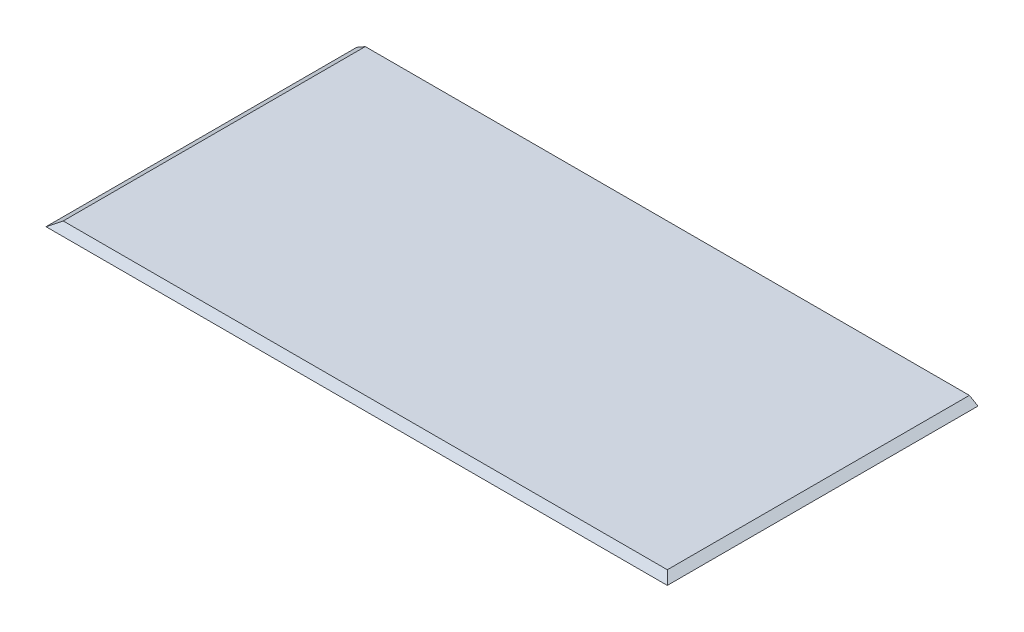
ISO-10303-21;
HEADER;
FILE_DESCRIPTION(('STEP AP214'),'2;1');
FILE_NAME('part.step','',(''),(''),'','','');
FILE_SCHEMA(('AUTOMOTIVE_DESIGN { 1 0 10303 214 1 1 1 1 }'));
ENDSEC;
DATA;
#1=APPLICATION_CONTEXT('core data for automotive mechanical design processes');
#2=APPLICATION_PROTOCOL_DEFINITION('international standard','automotive_design',2000,#1);
#3=PRODUCT_CONTEXT('',#1,'mechanical');
#4=PRODUCT('Part','Part','',(#3));
#5=PRODUCT_RELATED_PRODUCT_CATEGORY('part','',(#4));
#6=PRODUCT_DEFINITION_FORMATION('','',#4);
#7=PRODUCT_DEFINITION_CONTEXT('part definition',#1,'design');
#8=PRODUCT_DEFINITION('design','',#6,#7);
#9=PRODUCT_DEFINITION_SHAPE('','',#8);
#10=(LENGTH_UNIT() NAMED_UNIT(*) SI_UNIT(.MILLI.,.METRE.));
#11=(NAMED_UNIT(*) PLANE_ANGLE_UNIT() SI_UNIT($,.RADIAN.));
#12=(NAMED_UNIT(*) SI_UNIT($,.STERADIAN.) SOLID_ANGLE_UNIT());
#13=UNCERTAINTY_MEASURE_WITH_UNIT(LENGTH_MEASURE(1.E-05),#10,'distance_accuracy_value','');
#14=(GEOMETRIC_REPRESENTATION_CONTEXT(3) GLOBAL_UNCERTAINTY_ASSIGNED_CONTEXT((#13)) GLOBAL_UNIT_ASSIGNED_CONTEXT((#10,
#11,#12)) REPRESENTATION_CONTEXT('',''));
#15=CARTESIAN_POINT('',(0.,0.,0.));
#16=DIRECTION('',(0.,0.,1.));
#17=DIRECTION('',(1.,0.,0.));
#18=AXIS2_PLACEMENT_3D('',#15,#16,#17);
#19=CARTESIAN_POINT('',(0.,0.,0.));
#20=DIRECTION('',(0.,-1.,0.));
#21=DIRECTION('',(0.,0.,-1.));
#22=AXIS2_PLACEMENT_3D('',#19,#20,#21);
#23=PLANE('',#22);
#24=DIRECTION('',(-1.,0.,0.));
#25=VECTOR('',#24,1.);
#26=CARTESIAN_POINT('',(-125.,0.,0.));
#27=LINE('',#26,#25);
#28=CARTESIAN_POINT('',(125.,0.,0.));
#29=VERTEX_POINT('',#28);
#30=CARTESIAN_POINT('',(-125.,0.,0.));
#31=VERTEX_POINT('',#30);
#32=EDGE_CURVE('E176',#29,#31,#27,.T.);
#33=ORIENTED_EDGE('',*,*,#32,.T.);
#34=DIRECTION('',(0.,0.,1.));
#35=VECTOR('',#34,1.);
#36=CARTESIAN_POINT('',(-125.,0.,125.));
#37=LINE('',#36,#35);
#38=CARTESIAN_POINT('',(-125.,0.,-125.));
#39=VERTEX_POINT('',#38);
#40=EDGE_CURVE('E184',#39,#31,#37,.T.);
#41=ORIENTED_EDGE('',*,*,#40,.F.);
#42=DIRECTION('',(-1.,0.,0.));
#43=VECTOR('',#42,1.);
#44=CARTESIAN_POINT('',(-125.,0.,-125.));
#45=LINE('',#44,#43);
#46=CARTESIAN_POINT('',(125.,0.,-125.));
#47=VERTEX_POINT('',#46);
#48=EDGE_CURVE('E190',#47,#39,#45,.T.);
#49=ORIENTED_EDGE('',*,*,#48,.F.);
#50=DIRECTION('',(0.,0.,-1.));
#51=VECTOR('',#50,1.);
#52=CARTESIAN_POINT('',(125.,0.,125.));
#53=LINE('',#52,#51);
#54=EDGE_CURVE('E193',#29,#47,#53,.T.);
#55=ORIENTED_EDGE('',*,*,#54,.F.);
#56=EDGE_LOOP('',(#33,#41,#49,#55));
#57=FACE_BOUND('',#56,.T.);
#58=DIRECTION('',(1.,0.,0.));
#59=VECTOR('',#58,1.);
#60=CARTESIAN_POINT('',(-110.253353701861,0.,-24.7032689142541));
#61=LINE('',#60,#59);
#62=CARTESIAN_POINT('',(-110.253353701861,0.,-24.7032689142541));
#63=VERTEX_POINT('',#62);
#64=CARTESIAN_POINT('',(-100.253353701861,0.,-24.7032689142541));
#65=VERTEX_POINT('',#64);
#66=EDGE_CURVE('E315',#63,#65,#61,.T.);
#67=ORIENTED_EDGE('',*,*,#66,.F.);
#68=DIRECTION('',(0.,0.,-1.));
#69=VECTOR('',#68,1.);
#70=CARTESIAN_POINT('',(-110.253353701861,0.,-14.7032689142541));
#71=LINE('',#70,#69);
#72=CARTESIAN_POINT('',(-110.253353701861,0.,-14.7032689142541));
#73=VERTEX_POINT('',#72);
#74=EDGE_CURVE('E301',#73,#63,#71,.T.);
#75=ORIENTED_EDGE('',*,*,#74,.F.);
#76=DIRECTION('',(-1.,0.,0.));
#77=VECTOR('',#76,1.);
#78=CARTESIAN_POINT('',(-110.253353701861,0.,-14.7032689142541));
#79=LINE('',#78,#77);
#80=CARTESIAN_POINT('',(-100.253353701861,0.,-14.7032689142541));
#81=VERTEX_POINT('',#80);
#82=EDGE_CURVE('E306',#81,#73,#79,.T.);
#83=ORIENTED_EDGE('',*,*,#82,.F.);
#84=DIRECTION('',(0.,0.,1.));
#85=VECTOR('',#84,1.);
#86=CARTESIAN_POINT('',(-100.253353701861,0.,-14.7032689142541));
#87=LINE('',#86,#85);
#88=EDGE_CURVE('E317',#65,#81,#87,.T.);
#89=ORIENTED_EDGE('',*,*,#88,.F.);
#90=EDGE_LOOP('',(#67,#75,#83,#89));
#91=FACE_BOUND('',#90,.T.);
#92=DIRECTION('',(1.,0.,0.));
#93=VECTOR('',#92,1.);
#94=CARTESIAN_POINT('',(-110.253353701861,0.,-109.703268914254));
#95=LINE('',#94,#93);
#96=CARTESIAN_POINT('',(-110.253353701861,0.,-109.703268914254));
#97=VERTEX_POINT('',#96);
#98=CARTESIAN_POINT('',(-100.253353701861,0.,-109.703268914254));
#99=VERTEX_POINT('',#98);
#100=EDGE_CURVE('E286',#97,#99,#95,.T.);
#101=ORIENTED_EDGE('',*,*,#100,.F.);
#102=DIRECTION('',(0.,0.,-1.));
#103=VECTOR('',#102,1.);
#104=CARTESIAN_POINT('',(-110.253353701861,0.,-99.7032689142541));
#105=LINE('',#104,#103);
#106=CARTESIAN_POINT('',(-110.253353701861,0.,-99.7032689142541));
#107=VERTEX_POINT('',#106);
#108=EDGE_CURVE('E272',#107,#97,#105,.T.);
#109=ORIENTED_EDGE('',*,*,#108,.F.);
#110=DIRECTION('',(-1.,0.,0.));
#111=VECTOR('',#110,1.);
#112=CARTESIAN_POINT('',(-110.253353701861,0.,-99.7032689142541));
#113=LINE('',#112,#111);
#114=CARTESIAN_POINT('',(-100.253353701861,0.,-99.7032689142541));
#115=VERTEX_POINT('',#114);
#116=EDGE_CURVE('E277',#115,#107,#113,.T.);
#117=ORIENTED_EDGE('',*,*,#116,.F.);
#118=DIRECTION('',(0.,0.,1.));
#119=VECTOR('',#118,1.);
#120=CARTESIAN_POINT('',(-100.253353701861,0.,-99.7032689142541));
#121=LINE('',#120,#119);
#122=EDGE_CURVE('E288',#99,#115,#121,.T.);
#123=ORIENTED_EDGE('',*,*,#122,.F.);
#124=EDGE_LOOP('',(#101,#109,#117,#123));
#125=FACE_BOUND('',#124,.T.);
#126=DIRECTION('',(1.,0.,0.));
#127=VECTOR('',#126,1.);
#128=CARTESIAN_POINT('',(99.7466462981393,0.,-24.7032689142542));
#129=LINE('',#128,#127);
#130=CARTESIAN_POINT('',(99.7466462981393,0.,-24.7032689142542));
#131=VERTEX_POINT('',#130);
#132=CARTESIAN_POINT('',(109.746646298139,0.,-24.7032689142542));
#133=VERTEX_POINT('',#132);
#134=EDGE_CURVE('E259',#131,#133,#129,.T.);
#135=ORIENTED_EDGE('',*,*,#134,.F.);
#136=DIRECTION('',(0.,0.,-1.));
#137=VECTOR('',#136,1.);
#138=CARTESIAN_POINT('',(99.7466462981393,0.,-14.7032689142542));
#139=LINE('',#138,#137);
#140=CARTESIAN_POINT('',(99.7466462981393,0.,-14.7032689142542));
#141=VERTEX_POINT('',#140);
#142=EDGE_CURVE('E245',#141,#131,#139,.T.);
#143=ORIENTED_EDGE('',*,*,#142,.F.);
#144=DIRECTION('',(-1.,0.,0.));
#145=VECTOR('',#144,1.);
#146=CARTESIAN_POINT('',(99.7466462981393,0.,-14.7032689142542));
#147=LINE('',#146,#145);
#148=CARTESIAN_POINT('',(109.746646298139,0.,-14.7032689142542));
#149=VERTEX_POINT('',#148);
#150=EDGE_CURVE('E250',#149,#141,#147,.T.);
#151=ORIENTED_EDGE('',*,*,#150,.F.);
#152=DIRECTION('',(0.,0.,1.));
#153=VECTOR('',#152,1.);
#154=CARTESIAN_POINT('',(109.746646298139,0.,-14.7032689142542));
#155=LINE('',#154,#153);
#156=EDGE_CURVE('E261',#133,#149,#155,.T.);
#157=ORIENTED_EDGE('',*,*,#156,.F.);
#158=EDGE_LOOP('',(#135,#143,#151,#157));
#159=FACE_BOUND('',#158,.T.);
#160=DIRECTION('',(1.,0.,0.));
#161=VECTOR('',#160,1.);
#162=CARTESIAN_POINT('',(99.7466462981393,0.,-109.703268914254));
#163=LINE('',#162,#161);
#164=CARTESIAN_POINT('',(99.7466462981393,0.,-109.703268914254));
#165=VERTEX_POINT('',#164);
#166=CARTESIAN_POINT('',(109.746646298139,0.,-109.703268914254));
#167=VERTEX_POINT('',#166);
#168=EDGE_CURVE('E232',#165,#167,#163,.T.);
#169=ORIENTED_EDGE('',*,*,#168,.F.);
#170=DIRECTION('',(0.,0.,-1.));
#171=VECTOR('',#170,1.);
#172=CARTESIAN_POINT('',(99.7466462981393,0.,-99.7032689142542));
#173=LINE('',#172,#171);
#174=CARTESIAN_POINT('',(99.7466462981393,0.,-99.7032689142542));
#175=VERTEX_POINT('',#174);
#176=EDGE_CURVE('E213',#175,#165,#173,.T.);
#177=ORIENTED_EDGE('',*,*,#176,.F.);
#178=DIRECTION('',(-1.,0.,0.));
#179=VECTOR('',#178,1.);
#180=CARTESIAN_POINT('',(99.7466462981393,0.,-99.7032689142542));
#181=LINE('',#180,#179);
#182=CARTESIAN_POINT('',(109.746646298139,0.,-99.7032689142542));
#183=VERTEX_POINT('',#182);
#184=EDGE_CURVE('E223',#183,#175,#181,.T.);
#185=ORIENTED_EDGE('',*,*,#184,.F.);
#186=DIRECTION('',(0.,0.,1.));
#187=VECTOR('',#186,1.);
#188=CARTESIAN_POINT('',(109.746646298139,0.,-99.7032689142542));
#189=LINE('',#188,#187);
#190=EDGE_CURVE('E234',#167,#183,#189,.T.);
#191=ORIENTED_EDGE('',*,*,#190,.F.);
#192=EDGE_LOOP('',(#169,#177,#185,#191));
#193=FACE_BOUND('',#192,.T.);
#194=ADVANCED_FACE('F34',(#57,#91,#125,#159,#193),#23,.T.);
#195=CARTESIAN_POINT('',(-125.,2.,-125.));
#196=DIRECTION('',(0.,0.,1.));
#197=DIRECTION('',(1.,0.,0.));
#198=AXIS2_PLACEMENT_3D('',#195,#196,#197);
#199=PLANE('',#198);
#200=DIRECTION('',(-1.,0.,0.));
#201=VECTOR('',#200,1.);
#202=CARTESIAN_POINT('',(-125.,2.,-125.));
#203=LINE('',#202,#201);
#204=CARTESIAN_POINT('',(121.535898384862,2.,-125.));
#205=VERTEX_POINT('',#204);
#206=CARTESIAN_POINT('',(-121.535898384862,2.,-125.));
#207=VERTEX_POINT('',#206);
#208=EDGE_CURVE('E42',#205,#207,#203,.T.);
#209=ORIENTED_EDGE('',*,*,#208,.F.);
#210=DIRECTION('',(-0.866025403784441,0.499999999999995,0.));
#211=VECTOR('',#210,1.);
#212=CARTESIAN_POINT('',(121.535898384862,2.,-125.));
#213=LINE('',#212,#211);
#214=EDGE_CURVE('E207',#47,#205,#213,.T.);
#215=ORIENTED_EDGE('',*,*,#214,.F.);
#216=ORIENTED_EDGE('',*,*,#48,.T.);
#217=DIRECTION('',(-0.866025403784441,-0.499999999999995,0.));
#218=VECTOR('',#217,1.);
#219=CARTESIAN_POINT('',(-121.535898384862,2.,-125.));
#220=LINE('',#219,#218);
#221=EDGE_CURVE('E181',#207,#39,#220,.T.);
#222=ORIENTED_EDGE('',*,*,#221,.F.);
#223=EDGE_LOOP('',(#209,#215,#216,#222));
#224=FACE_BOUND('',#223,.T.);
#225=ADVANCED_FACE('F36',(#224),#199,.F.);
#226=CARTESIAN_POINT('',(0.,2.,0.));
#227=DIRECTION('',(0.,-1.,0.));
#228=DIRECTION('',(0.,0.,-1.));
#229=AXIS2_PLACEMENT_3D('',#226,#227,#228);
#230=PLANE('',#229);
#231=DIRECTION('',(0.,0.,-1.));
#232=VECTOR('',#231,1.);
#233=CARTESIAN_POINT('',(-121.535898384862,2.,4.00000000000006));
#234=LINE('',#233,#232);
#235=CARTESIAN_POINT('',(-121.535898384862,2.,-3.4641016151378));
#236=VERTEX_POINT('',#235);
#237=EDGE_CURVE('E211',#236,#207,#234,.T.);
#238=ORIENTED_EDGE('',*,*,#237,.F.);
#239=DIRECTION('',(1.,0.,0.));
#240=VECTOR('',#239,1.);
#241=CARTESIAN_POINT('',(-125.,2.,-3.4641016151378));
#242=LINE('',#241,#240);
#243=CARTESIAN_POINT('',(121.535898384862,2.,-3.46410161513779));
#244=VERTEX_POINT('',#243);
#245=EDGE_CURVE('E178',#236,#244,#242,.T.);
#246=ORIENTED_EDGE('',*,*,#245,.T.);
#247=DIRECTION('',(0.,0.,-1.));
#248=VECTOR('',#247,1.);
#249=CARTESIAN_POINT('',(121.535898384862,2.,4.00000000000006));
#250=LINE('',#249,#248);
#251=EDGE_CURVE('E210',#244,#205,#250,.T.);
#252=ORIENTED_EDGE('',*,*,#251,.T.);
#253=ORIENTED_EDGE('',*,*,#208,.T.);
#254=EDGE_LOOP('',(#238,#246,#252,#253));
#255=FACE_BOUND('',#254,.T.);
#256=ADVANCED_FACE('F354',(#255),#230,.F.);
#257=CARTESIAN_POINT('',(-110.253353701861,-10.,-14.7032689142541));
#258=DIRECTION('',(1.,0.,0.));
#259=DIRECTION('',(0.,0.,-1.));
#260=AXIS2_PLACEMENT_3D('',#257,#258,#259);
#261=PLANE('',#260);
#262=ORIENTED_EDGE('',*,*,#74,.T.);
#263=DIRECTION('',(0.,1.,0.));
#264=VECTOR('',#263,1.);
#265=CARTESIAN_POINT('',(-110.253353701861,-10.,-24.7032689142541));
#266=LINE('',#265,#264);
#267=CARTESIAN_POINT('',(-110.253353701861,-10.,-24.7032689142541));
#268=VERTEX_POINT('',#267);
#269=EDGE_CURVE('E194',#268,#63,#266,.T.);
#270=ORIENTED_EDGE('',*,*,#269,.F.);
#271=DIRECTION('',(0.,0.,-1.));
#272=VECTOR('',#271,1.);
#273=CARTESIAN_POINT('',(-110.253353701861,-10.,-14.7032689142541));
#274=LINE('',#273,#272);
#275=CARTESIAN_POINT('',(-110.253353701861,-10.,-14.7032689142541));
#276=VERTEX_POINT('',#275);
#277=EDGE_CURVE('E302',#276,#268,#274,.T.);
#278=ORIENTED_EDGE('',*,*,#277,.F.);
#279=DIRECTION('',(0.,1.,0.));
#280=VECTOR('',#279,1.);
#281=CARTESIAN_POINT('',(-110.253353701861,-10.,-14.7032689142541));
#282=LINE('',#281,#280);
#283=EDGE_CURVE('E312',#276,#73,#282,.T.);
#284=ORIENTED_EDGE('',*,*,#283,.T.);
#285=EDGE_LOOP('',(#262,#270,#278,#284));
#286=FACE_BOUND('',#285,.T.);
#287=ADVANCED_FACE('F342',(#286),#261,.F.);
#288=CARTESIAN_POINT('',(-110.253353701861,-10.,-24.7032689142541));
#289=DIRECTION('',(0.,0.,1.));
#290=DIRECTION('',(1.,0.,0.));
#291=AXIS2_PLACEMENT_3D('',#288,#289,#290);
#292=PLANE('',#291);
#293=ORIENTED_EDGE('',*,*,#66,.T.);
#294=DIRECTION('',(0.,1.,0.));
#295=VECTOR('',#294,1.);
#296=CARTESIAN_POINT('',(-100.253353701861,-10.,-24.7032689142541));
#297=LINE('',#296,#295);
#298=CARTESIAN_POINT('',(-100.253353701861,-10.,-24.7032689142541));
#299=VERTEX_POINT('',#298);
#300=EDGE_CURVE('E197',#299,#65,#297,.T.);
#301=ORIENTED_EDGE('',*,*,#300,.F.);
#302=DIRECTION('',(1.,0.,0.));
#303=VECTOR('',#302,1.);
#304=CARTESIAN_POINT('',(-110.253353701861,-10.,-24.7032689142541));
#305=LINE('',#304,#303);
#306=EDGE_CURVE('E305',#268,#299,#305,.T.);
#307=ORIENTED_EDGE('',*,*,#306,.F.);
#308=ORIENTED_EDGE('',*,*,#269,.T.);
#309=EDGE_LOOP('',(#293,#301,#307,#308));
#310=FACE_BOUND('',#309,.T.);
#311=ADVANCED_FACE('F346',(#310),#292,.F.);
#312=CARTESIAN_POINT('',(-100.253353701861,-10.,-14.7032689142541));
#313=DIRECTION('',(-1.,0.,0.));
#314=DIRECTION('',(0.,0.,1.));
#315=AXIS2_PLACEMENT_3D('',#312,#313,#314);
#316=PLANE('',#315);
#317=ORIENTED_EDGE('',*,*,#88,.T.);
#318=DIRECTION('',(0.,1.,0.));
#319=VECTOR('',#318,1.);
#320=CARTESIAN_POINT('',(-100.253353701861,-10.,-14.7032689142541));
#321=LINE('',#320,#319);
#322=CARTESIAN_POINT('',(-100.253353701861,-10.,-14.7032689142541));
#323=VERTEX_POINT('',#322);
#324=EDGE_CURVE('E323',#323,#81,#321,.T.);
#325=ORIENTED_EDGE('',*,*,#324,.F.);
#326=DIRECTION('',(0.,0.,1.));
#327=VECTOR('',#326,1.);
#328=CARTESIAN_POINT('',(-100.253353701861,-10.,-14.7032689142541));
#329=LINE('',#328,#327);
#330=EDGE_CURVE('E308',#299,#323,#329,.T.);
#331=ORIENTED_EDGE('',*,*,#330,.F.);
#332=ORIENTED_EDGE('',*,*,#300,.T.);
#333=EDGE_LOOP('',(#317,#325,#331,#332));
#334=FACE_BOUND('',#333,.T.);
#335=ADVANCED_FACE('F329',(#334),#316,.F.);
#336=CARTESIAN_POINT('',(-110.253353701861,-10.,-14.7032689142541));
#337=DIRECTION('',(0.,0.,-1.));
#338=DIRECTION('',(-1.,0.,0.));
#339=AXIS2_PLACEMENT_3D('',#336,#337,#338);
#340=PLANE('',#339);
#341=ORIENTED_EDGE('',*,*,#82,.T.);
#342=ORIENTED_EDGE('',*,*,#283,.F.);
#343=DIRECTION('',(-1.,0.,0.));
#344=VECTOR('',#343,1.);
#345=CARTESIAN_POINT('',(-110.253353701861,-10.,-14.7032689142541));
#346=LINE('',#345,#344);
#347=EDGE_CURVE('E310',#323,#276,#346,.T.);
#348=ORIENTED_EDGE('',*,*,#347,.F.);
#349=ORIENTED_EDGE('',*,*,#324,.T.);
#350=EDGE_LOOP('',(#341,#342,#348,#349));
#351=FACE_BOUND('',#350,.T.);
#352=ADVANCED_FACE('F338',(#351),#340,.F.);
#353=CARTESIAN_POINT('',(0.,-10.,0.));
#354=DIRECTION('',(0.,-1.,0.));
#355=DIRECTION('',(0.,0.,-1.));
#356=AXIS2_PLACEMENT_3D('',#353,#354,#355);
#357=PLANE('',#356);
#358=ORIENTED_EDGE('',*,*,#277,.T.);
#359=ORIENTED_EDGE('',*,*,#306,.T.);
#360=ORIENTED_EDGE('',*,*,#330,.T.);
#361=ORIENTED_EDGE('',*,*,#347,.T.);
#362=EDGE_LOOP('',(#358,#359,#360,#361));
#363=FACE_BOUND('',#362,.T.);
#364=ADVANCED_FACE('F345',(#363),#357,.T.);
#365=CARTESIAN_POINT('',(-110.253353701861,-10.,-99.7032689142541));
#366=DIRECTION('',(1.,0.,0.));
#367=DIRECTION('',(0.,0.,-1.));
#368=AXIS2_PLACEMENT_3D('',#365,#366,#367);
#369=PLANE('',#368);
#370=ORIENTED_EDGE('',*,*,#108,.T.);
#371=DIRECTION('',(0.,1.,0.));
#372=VECTOR('',#371,1.);
#373=CARTESIAN_POINT('',(-110.253353701861,-10.,-109.703268914254));
#374=LINE('',#373,#372);
#375=CARTESIAN_POINT('',(-110.253353701861,-10.,-109.703268914254));
#376=VERTEX_POINT('',#375);
#377=EDGE_CURVE('E299',#376,#97,#374,.T.);
#378=ORIENTED_EDGE('',*,*,#377,.F.);
#379=DIRECTION('',(0.,0.,-1.));
#380=VECTOR('',#379,1.);
#381=CARTESIAN_POINT('',(-110.253353701861,-10.,-99.7032689142541));
#382=LINE('',#381,#380);
#383=CARTESIAN_POINT('',(-110.253353701861,-10.,-99.7032689142541));
#384=VERTEX_POINT('',#383);
#385=EDGE_CURVE('E273',#384,#376,#382,.T.);
#386=ORIENTED_EDGE('',*,*,#385,.F.);
#387=DIRECTION('',(0.,1.,0.));
#388=VECTOR('',#387,1.);
#389=CARTESIAN_POINT('',(-110.253353701861,-10.,-99.7032689142541));
#390=LINE('',#389,#388);
#391=EDGE_CURVE('E283',#384,#107,#390,.T.);
#392=ORIENTED_EDGE('',*,*,#391,.T.);
#393=EDGE_LOOP('',(#370,#378,#386,#392));
#394=FACE_BOUND('',#393,.T.);
#395=ADVANCED_FACE('F429',(#394),#369,.F.);
#396=CARTESIAN_POINT('',(-110.253353701861,-10.,-109.703268914254));
#397=DIRECTION('',(0.,0.,1.));
#398=DIRECTION('',(1.,0.,0.));
#399=AXIS2_PLACEMENT_3D('',#396,#397,#398);
#400=PLANE('',#399);
#401=ORIENTED_EDGE('',*,*,#100,.T.);
#402=DIRECTION('',(0.,1.,0.));
#403=VECTOR('',#402,1.);
#404=CARTESIAN_POINT('',(-100.253353701861,-10.,-109.703268914254));
#405=LINE('',#404,#403);
#406=CARTESIAN_POINT('',(-100.253353701861,-10.,-109.703268914254));
#407=VERTEX_POINT('',#406);
#408=EDGE_CURVE('E296',#407,#99,#405,.T.);
#409=ORIENTED_EDGE('',*,*,#408,.F.);
#410=DIRECTION('',(1.,0.,0.));
#411=VECTOR('',#410,1.);
#412=CARTESIAN_POINT('',(-110.253353701861,-10.,-109.703268914254));
#413=LINE('',#412,#411);
#414=EDGE_CURVE('E276',#376,#407,#413,.T.);
#415=ORIENTED_EDGE('',*,*,#414,.F.);
#416=ORIENTED_EDGE('',*,*,#377,.T.);
#417=EDGE_LOOP('',(#401,#409,#415,#416));
#418=FACE_BOUND('',#417,.T.);
#419=ADVANCED_FACE('F425',(#418),#400,.F.);
#420=CARTESIAN_POINT('',(-100.253353701861,-10.,-99.7032689142541));
#421=DIRECTION('',(-1.,0.,0.));
#422=DIRECTION('',(0.,0.,1.));
#423=AXIS2_PLACEMENT_3D('',#420,#421,#422);
#424=PLANE('',#423);
#425=ORIENTED_EDGE('',*,*,#122,.T.);
#426=DIRECTION('',(0.,1.,0.));
#427=VECTOR('',#426,1.);
#428=CARTESIAN_POINT('',(-100.253353701861,-10.,-99.7032689142541));
#429=LINE('',#428,#427);
#430=CARTESIAN_POINT('',(-100.253353701861,-10.,-99.7032689142541));
#431=VERTEX_POINT('',#430);
#432=EDGE_CURVE('E294',#431,#115,#429,.T.);
#433=ORIENTED_EDGE('',*,*,#432,.F.);
#434=DIRECTION('',(0.,0.,1.));
#435=VECTOR('',#434,1.);
#436=CARTESIAN_POINT('',(-100.253353701861,-10.,-99.7032689142541));
#437=LINE('',#436,#435);
#438=EDGE_CURVE('E279',#407,#431,#437,.T.);
#439=ORIENTED_EDGE('',*,*,#438,.F.);
#440=ORIENTED_EDGE('',*,*,#408,.T.);
#441=EDGE_LOOP('',(#425,#433,#439,#440));
#442=FACE_BOUND('',#441,.T.);
#443=ADVANCED_FACE('F421',(#442),#424,.F.);
#444=CARTESIAN_POINT('',(-110.253353701861,-10.,-99.7032689142541));
#445=DIRECTION('',(0.,0.,-1.));
#446=DIRECTION('',(-1.,0.,0.));
#447=AXIS2_PLACEMENT_3D('',#444,#445,#446);
#448=PLANE('',#447);
#449=ORIENTED_EDGE('',*,*,#116,.T.);
#450=ORIENTED_EDGE('',*,*,#391,.F.);
#451=DIRECTION('',(-1.,0.,0.));
#452=VECTOR('',#451,1.);
#453=CARTESIAN_POINT('',(-110.253353701861,-10.,-99.7032689142541));
#454=LINE('',#453,#452);
#455=EDGE_CURVE('E281',#431,#384,#454,.T.);
#456=ORIENTED_EDGE('',*,*,#455,.F.);
#457=ORIENTED_EDGE('',*,*,#432,.T.);
#458=EDGE_LOOP('',(#449,#450,#456,#457));
#459=FACE_BOUND('',#458,.T.);
#460=ADVANCED_FACE('F417',(#459),#448,.F.);
#461=CARTESIAN_POINT('',(0.,-10.,0.));
#462=DIRECTION('',(0.,-1.,0.));
#463=DIRECTION('',(0.,0.,-1.));
#464=AXIS2_PLACEMENT_3D('',#461,#462,#463);
#465=PLANE('',#464);
#466=ORIENTED_EDGE('',*,*,#385,.T.);
#467=ORIENTED_EDGE('',*,*,#414,.T.);
#468=ORIENTED_EDGE('',*,*,#438,.T.);
#469=ORIENTED_EDGE('',*,*,#455,.T.);
#470=EDGE_LOOP('',(#466,#467,#468,#469));
#471=FACE_BOUND('',#470,.T.);
#472=ADVANCED_FACE('F413',(#471),#465,.T.);
#473=CARTESIAN_POINT('',(99.7466462981393,-10.,-14.7032689142542));
#474=DIRECTION('',(1.,0.,0.));
#475=DIRECTION('',(0.,0.,-1.));
#476=AXIS2_PLACEMENT_3D('',#473,#474,#475);
#477=PLANE('',#476);
#478=ORIENTED_EDGE('',*,*,#142,.T.);
#479=DIRECTION('',(0.,1.,0.));
#480=VECTOR('',#479,1.);
#481=CARTESIAN_POINT('',(99.7466462981393,-10.,-24.7032689142542));
#482=LINE('',#481,#480);
#483=CARTESIAN_POINT('',(99.7466462981393,-10.,-24.7032689142542));
#484=VERTEX_POINT('',#483);
#485=EDGE_CURVE('E270',#484,#131,#482,.T.);
#486=ORIENTED_EDGE('',*,*,#485,.F.);
#487=DIRECTION('',(0.,0.,-1.));
#488=VECTOR('',#487,1.);
#489=CARTESIAN_POINT('',(99.7466462981393,-10.,-14.7032689142542));
#490=LINE('',#489,#488);
#491=CARTESIAN_POINT('',(99.7466462981393,-10.,-14.7032689142542));
#492=VERTEX_POINT('',#491);
#493=EDGE_CURVE('E246',#492,#484,#490,.T.);
#494=ORIENTED_EDGE('',*,*,#493,.F.);
#495=DIRECTION('',(0.,1.,0.));
#496=VECTOR('',#495,1.);
#497=CARTESIAN_POINT('',(99.7466462981393,-10.,-14.7032689142542));
#498=LINE('',#497,#496);
#499=EDGE_CURVE('E256',#492,#141,#498,.T.);
#500=ORIENTED_EDGE('',*,*,#499,.T.);
#501=EDGE_LOOP('',(#478,#486,#494,#500));
#502=FACE_BOUND('',#501,.T.);
#503=ADVANCED_FACE('F409',(#502),#477,.F.);
#504=CARTESIAN_POINT('',(99.7466462981393,-10.,-24.7032689142542));
#505=DIRECTION('',(0.,0.,1.));
#506=DIRECTION('',(1.,0.,0.));
#507=AXIS2_PLACEMENT_3D('',#504,#505,#506);
#508=PLANE('',#507);
#509=ORIENTED_EDGE('',*,*,#134,.T.);
#510=DIRECTION('',(0.,1.,0.));
#511=VECTOR('',#510,1.);
#512=CARTESIAN_POINT('',(109.746646298139,-10.,-24.7032689142542));
#513=LINE('',#512,#511);
#514=CARTESIAN_POINT('',(109.746646298139,-10.,-24.7032689142542));
#515=VERTEX_POINT('',#514);
#516=EDGE_CURVE('E267',#515,#133,#513,.T.);
#517=ORIENTED_EDGE('',*,*,#516,.F.);
#518=DIRECTION('',(1.,0.,0.));
#519=VECTOR('',#518,1.);
#520=CARTESIAN_POINT('',(99.7466462981393,-10.,-24.7032689142542));
#521=LINE('',#520,#519);
#522=EDGE_CURVE('E249',#484,#515,#521,.T.);
#523=ORIENTED_EDGE('',*,*,#522,.F.);
#524=ORIENTED_EDGE('',*,*,#485,.T.);
#525=EDGE_LOOP('',(#509,#517,#523,#524));
#526=FACE_BOUND('',#525,.T.);
#527=ADVANCED_FACE('F405',(#526),#508,.F.);
#528=CARTESIAN_POINT('',(109.746646298139,-10.,-14.7032689142542));
#529=DIRECTION('',(-1.,0.,0.));
#530=DIRECTION('',(0.,0.,1.));
#531=AXIS2_PLACEMENT_3D('',#528,#529,#530);
#532=PLANE('',#531);
#533=ORIENTED_EDGE('',*,*,#156,.T.);
#534=DIRECTION('',(0.,1.,0.));
#535=VECTOR('',#534,1.);
#536=CARTESIAN_POINT('',(109.746646298139,-10.,-14.7032689142542));
#537=LINE('',#536,#535);
#538=CARTESIAN_POINT('',(109.746646298139,-10.,-14.7032689142542));
#539=VERTEX_POINT('',#538);
#540=EDGE_CURVE('E57',#539,#149,#537,.T.);
#541=ORIENTED_EDGE('',*,*,#540,.F.);
#542=DIRECTION('',(0.,0.,1.));
#543=VECTOR('',#542,1.);
#544=CARTESIAN_POINT('',(109.746646298139,-10.,-14.7032689142542));
#545=LINE('',#544,#543);
#546=EDGE_CURVE('E252',#515,#539,#545,.T.);
#547=ORIENTED_EDGE('',*,*,#546,.F.);
#548=ORIENTED_EDGE('',*,*,#516,.T.);
#549=EDGE_LOOP('',(#533,#541,#547,#548));
#550=FACE_BOUND('',#549,.T.);
#551=ADVANCED_FACE('F402',(#550),#532,.F.);
#552=CARTESIAN_POINT('',(99.7466462981393,-10.,-14.7032689142542));
#553=DIRECTION('',(0.,0.,-1.));
#554=DIRECTION('',(-1.,0.,0.));
#555=AXIS2_PLACEMENT_3D('',#552,#553,#554);
#556=PLANE('',#555);
#557=ORIENTED_EDGE('',*,*,#150,.T.);
#558=ORIENTED_EDGE('',*,*,#499,.F.);
#559=DIRECTION('',(-1.,0.,0.));
#560=VECTOR('',#559,1.);
#561=CARTESIAN_POINT('',(99.7466462981393,-10.,-14.7032689142542));
#562=LINE('',#561,#560);
#563=EDGE_CURVE('E254',#539,#492,#562,.T.);
#564=ORIENTED_EDGE('',*,*,#563,.F.);
#565=ORIENTED_EDGE('',*,*,#540,.T.);
#566=EDGE_LOOP('',(#557,#558,#564,#565));
#567=FACE_BOUND('',#566,.T.);
#568=ADVANCED_FACE('F398',(#567),#556,.F.);
#569=CARTESIAN_POINT('',(0.,-10.,0.));
#570=DIRECTION('',(0.,-1.,0.));
#571=DIRECTION('',(0.,0.,-1.));
#572=AXIS2_PLACEMENT_3D('',#569,#570,#571);
#573=PLANE('',#572);
#574=ORIENTED_EDGE('',*,*,#493,.T.);
#575=ORIENTED_EDGE('',*,*,#522,.T.);
#576=ORIENTED_EDGE('',*,*,#546,.T.);
#577=ORIENTED_EDGE('',*,*,#563,.T.);
#578=EDGE_LOOP('',(#574,#575,#576,#577));
#579=FACE_BOUND('',#578,.T.);
#580=ADVANCED_FACE('F394',(#579),#573,.T.);
#581=CARTESIAN_POINT('',(99.7466462981393,-10.,-99.7032689142542));
#582=DIRECTION('',(1.,0.,0.));
#583=DIRECTION('',(0.,0.,-1.));
#584=AXIS2_PLACEMENT_3D('',#581,#582,#583);
#585=PLANE('',#584);
#586=ORIENTED_EDGE('',*,*,#176,.T.);
#587=DIRECTION('',(0.,1.,0.));
#588=VECTOR('',#587,1.);
#589=CARTESIAN_POINT('',(99.7466462981393,-10.,-109.703268914254));
#590=LINE('',#589,#588);
#591=CARTESIAN_POINT('',(99.7466462981393,-10.,-109.703268914254));
#592=VERTEX_POINT('',#591);
#593=EDGE_CURVE('E243',#592,#165,#590,.T.);
#594=ORIENTED_EDGE('',*,*,#593,.F.);
#595=DIRECTION('',(0.,0.,-1.));
#596=VECTOR('',#595,1.);
#597=CARTESIAN_POINT('',(99.7466462981393,-10.,-99.7032689142542));
#598=LINE('',#597,#596);
#599=CARTESIAN_POINT('',(99.7466462981393,-10.,-99.7032689142542));
#600=VERTEX_POINT('',#599);
#601=EDGE_CURVE('E219',#600,#592,#598,.T.);
#602=ORIENTED_EDGE('',*,*,#601,.F.);
#603=DIRECTION('',(0.,1.,0.));
#604=VECTOR('',#603,1.);
#605=CARTESIAN_POINT('',(99.7466462981393,-10.,-99.7032689142542));
#606=LINE('',#605,#604);
#607=EDGE_CURVE('E229',#600,#175,#606,.T.);
#608=ORIENTED_EDGE('',*,*,#607,.T.);
#609=EDGE_LOOP('',(#586,#594,#602,#608));
#610=FACE_BOUND('',#609,.T.);
#611=ADVANCED_FACE('F390',(#610),#585,.F.);
#612=CARTESIAN_POINT('',(99.7466462981393,-10.,-109.703268914254));
#613=DIRECTION('',(0.,0.,1.));
#614=DIRECTION('',(1.,0.,0.));
#615=AXIS2_PLACEMENT_3D('',#612,#613,#614);
#616=PLANE('',#615);
#617=ORIENTED_EDGE('',*,*,#168,.T.);
#618=DIRECTION('',(0.,1.,0.));
#619=VECTOR('',#618,1.);
#620=CARTESIAN_POINT('',(109.746646298139,-10.,-109.703268914254));
#621=LINE('',#620,#619);
#622=CARTESIAN_POINT('',(109.746646298139,-10.,-109.703268914254));
#623=VERTEX_POINT('',#622);
#624=EDGE_CURVE('E240',#623,#167,#621,.T.);
#625=ORIENTED_EDGE('',*,*,#624,.F.);
#626=DIRECTION('',(1.,0.,0.));
#627=VECTOR('',#626,1.);
#628=CARTESIAN_POINT('',(99.7466462981393,-10.,-109.703268914254));
#629=LINE('',#628,#627);
#630=EDGE_CURVE('E222',#592,#623,#629,.T.);
#631=ORIENTED_EDGE('',*,*,#630,.F.);
#632=ORIENTED_EDGE('',*,*,#593,.T.);
#633=EDGE_LOOP('',(#617,#625,#631,#632));
#634=FACE_BOUND('',#633,.T.);
#635=ADVANCED_FACE('F386',(#634),#616,.F.);
#636=CARTESIAN_POINT('',(109.746646298139,-10.,-99.7032689142542));
#637=DIRECTION('',(-1.,0.,0.));
#638=DIRECTION('',(0.,0.,1.));
#639=AXIS2_PLACEMENT_3D('',#636,#637,#638);
#640=PLANE('',#639);
#641=ORIENTED_EDGE('',*,*,#190,.T.);
#642=DIRECTION('',(0.,1.,0.));
#643=VECTOR('',#642,1.);
#644=CARTESIAN_POINT('',(109.746646298139,-10.,-99.7032689142542));
#645=LINE('',#644,#643);
#646=CARTESIAN_POINT('',(109.746646298139,-10.,-99.7032689142542));
#647=VERTEX_POINT('',#646);
#648=EDGE_CURVE('E49',#647,#183,#645,.T.);
#649=ORIENTED_EDGE('',*,*,#648,.F.);
#650=DIRECTION('',(0.,0.,1.));
#651=VECTOR('',#650,1.);
#652=CARTESIAN_POINT('',(109.746646298139,-10.,-99.7032689142542));
#653=LINE('',#652,#651);
#654=EDGE_CURVE('E225',#623,#647,#653,.T.);
#655=ORIENTED_EDGE('',*,*,#654,.F.);
#656=ORIENTED_EDGE('',*,*,#624,.T.);
#657=EDGE_LOOP('',(#641,#649,#655,#656));
#658=FACE_BOUND('',#657,.T.);
#659=ADVANCED_FACE('F383',(#658),#640,.F.);
#660=CARTESIAN_POINT('',(99.7466462981393,-10.,-99.7032689142542));
#661=DIRECTION('',(0.,0.,-1.));
#662=DIRECTION('',(-1.,0.,0.));
#663=AXIS2_PLACEMENT_3D('',#660,#661,#662);
#664=PLANE('',#663);
#665=ORIENTED_EDGE('',*,*,#184,.T.);
#666=ORIENTED_EDGE('',*,*,#607,.F.);
#667=DIRECTION('',(-1.,0.,0.));
#668=VECTOR('',#667,1.);
#669=CARTESIAN_POINT('',(99.7466462981393,-10.,-99.7032689142542));
#670=LINE('',#669,#668);
#671=EDGE_CURVE('E227',#647,#600,#670,.T.);
#672=ORIENTED_EDGE('',*,*,#671,.F.);
#673=ORIENTED_EDGE('',*,*,#648,.T.);
#674=EDGE_LOOP('',(#665,#666,#672,#673));
#675=FACE_BOUND('',#674,.T.);
#676=ADVANCED_FACE('F379',(#675),#664,.F.);
#677=CARTESIAN_POINT('',(0.,-10.,0.));
#678=DIRECTION('',(0.,-1.,0.));
#679=DIRECTION('',(0.,0.,-1.));
#680=AXIS2_PLACEMENT_3D('',#677,#678,#679);
#681=PLANE('',#680);
#682=ORIENTED_EDGE('',*,*,#601,.T.);
#683=ORIENTED_EDGE('',*,*,#630,.T.);
#684=ORIENTED_EDGE('',*,*,#654,.T.);
#685=ORIENTED_EDGE('',*,*,#671,.T.);
#686=EDGE_LOOP('',(#682,#683,#684,#685));
#687=FACE_BOUND('',#686,.T.);
#688=ADVANCED_FACE('F374',(#687),#681,.T.);
#689=CARTESIAN_POINT('',(-121.535898384862,2.,4.00000000000006));
#690=DIRECTION('',(0.499999999999995,-0.866025403784441,0.));
#691=DIRECTION('',(0.866025403784441,0.499999999999995,0.));
#692=AXIS2_PLACEMENT_3D('',#689,#690,#691);
#693=PLANE('',#692);
#694=ORIENTED_EDGE('',*,*,#40,.T.);
#695=DIRECTION('',(0.654653670707978,0.377964473009223,-0.654653670707979));
#696=VECTOR('',#695,1.);
#697=CARTESIAN_POINT('',(-124.734799077064,0.153113824246346,-0.265200922935848));
#698=LINE('',#697,#696);
#699=EDGE_CURVE('E172',#31,#236,#698,.T.);
#700=ORIENTED_EDGE('',*,*,#699,.T.);
#701=ORIENTED_EDGE('',*,*,#237,.T.);
#702=ORIENTED_EDGE('',*,*,#221,.T.);
#703=EDGE_LOOP('',(#694,#700,#701,#702));
#704=FACE_BOUND('',#703,.T.);
#705=ADVANCED_FACE('F185',(#704),#693,.F.);
#706=CARTESIAN_POINT('',(121.535898384862,2.,4.00000000000006));
#707=DIRECTION('',(-0.499999999999995,-0.866025403784441,0.));
#708=DIRECTION('',(0.866025403784441,-0.499999999999995,0.));
#709=AXIS2_PLACEMENT_3D('',#706,#707,#708);
#710=PLANE('',#709);
#711=ORIENTED_EDGE('',*,*,#251,.F.);
#712=DIRECTION('',(0.654653670707978,-0.377964473009223,0.654653670707979));
#713=VECTOR('',#712,1.);
#714=CARTESIAN_POINT('',(124.734799077064,0.153113824246346,-0.265200922935848));
#715=LINE('',#714,#713);
#716=EDGE_CURVE('E11',#244,#29,#715,.T.);
#717=ORIENTED_EDGE('',*,*,#716,.T.);
#718=ORIENTED_EDGE('',*,*,#54,.T.);
#719=ORIENTED_EDGE('',*,*,#214,.T.);
#720=EDGE_LOOP('',(#711,#717,#718,#719));
#721=FACE_BOUND('',#720,.T.);
#722=ADVANCED_FACE('F366',(#721),#710,.F.);
#723=CARTESIAN_POINT('',(-125.,0.,0.));
#724=DIRECTION('',(0.,-0.866025403784442,-0.499999999999995));
#725=DIRECTION('',(0.,0.499999999999995,-0.866025403784442));
#726=AXIS2_PLACEMENT_3D('',#723,#724,#725);
#727=PLANE('',#726);
#728=ORIENTED_EDGE('',*,*,#32,.F.);
#729=ORIENTED_EDGE('',*,*,#716,.F.);
#730=ORIENTED_EDGE('',*,*,#245,.F.);
#731=ORIENTED_EDGE('',*,*,#699,.F.);
#732=EDGE_LOOP('',(#728,#729,#730,#731));
#733=FACE_BOUND('',#732,.T.);
#734=ADVANCED_FACE('F174',(#733),#727,.F.);
#735=CLOSED_SHELL('',(#194,#225,#256,#287,#311,#335,#352,#364,#395,#419,#443,#460,#472,#503,
#527,#551,#568,#580,#611,#635,#659,#676,#688,#705,#722,#734));
#736=MANIFOLD_SOLID_BREP('B2',#735);
#737=ADVANCED_BREP_SHAPE_REPRESENTATION('',(#18,#736),#14);
#738=SHAPE_DEFINITION_REPRESENTATION(#9,#737);
ENDSEC;
END-ISO-10303-21;
